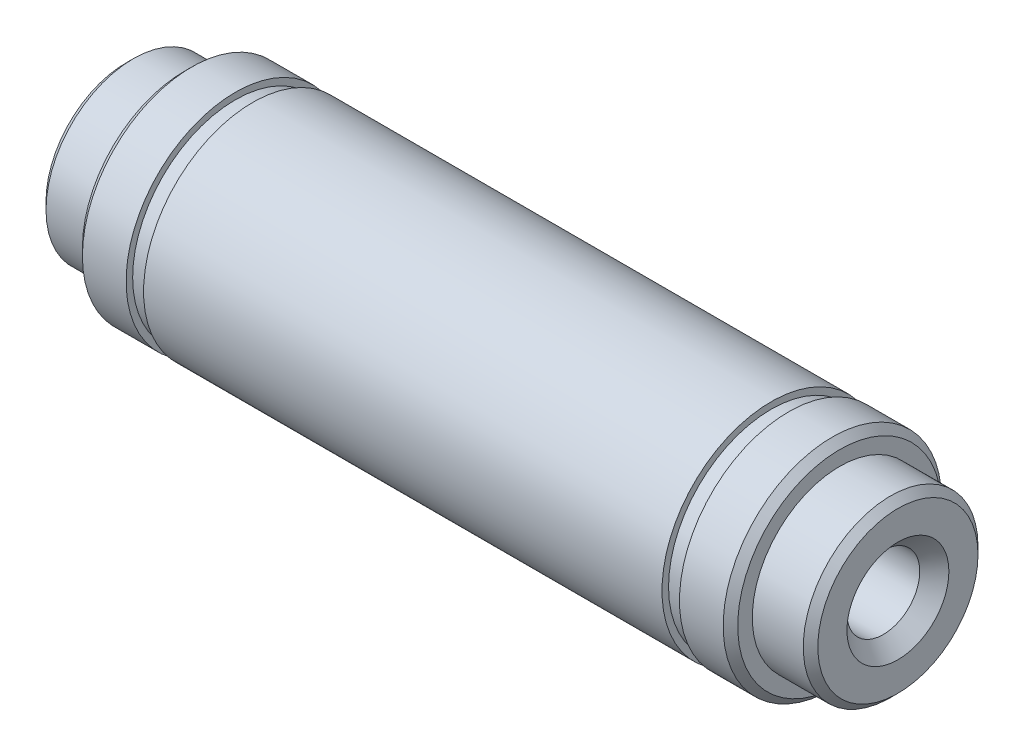
ISO-10303-21;
HEADER;
FILE_DESCRIPTION(('STEP AP214'),'2;1');
FILE_NAME('part.step','',(''),(''),'','','');
FILE_SCHEMA(('AUTOMOTIVE_DESIGN { 1 0 10303 214 1 1 1 1 }'));
ENDSEC;
DATA;
#1=APPLICATION_CONTEXT('core data for automotive mechanical design processes');
#2=APPLICATION_PROTOCOL_DEFINITION('international standard','automotive_design',2000,#1);
#3=PRODUCT_CONTEXT('',#1,'mechanical');
#4=PRODUCT('Part','Part','',(#3));
#5=PRODUCT_RELATED_PRODUCT_CATEGORY('part','',(#4));
#6=PRODUCT_DEFINITION_FORMATION('','',#4);
#7=PRODUCT_DEFINITION_CONTEXT('part definition',#1,'design');
#8=PRODUCT_DEFINITION('design','',#6,#7);
#9=PRODUCT_DEFINITION_SHAPE('','',#8);
#10=(LENGTH_UNIT() NAMED_UNIT(*) SI_UNIT(.MILLI.,.METRE.));
#11=(NAMED_UNIT(*) PLANE_ANGLE_UNIT() SI_UNIT($,.RADIAN.));
#12=(NAMED_UNIT(*) SI_UNIT($,.STERADIAN.) SOLID_ANGLE_UNIT());
#13=UNCERTAINTY_MEASURE_WITH_UNIT(LENGTH_MEASURE(1.E-05),#10,'distance_accuracy_value','');
#14=(GEOMETRIC_REPRESENTATION_CONTEXT(3) GLOBAL_UNCERTAINTY_ASSIGNED_CONTEXT((#13)) GLOBAL_UNIT_ASSIGNED_CONTEXT((#10,
#11,#12)) REPRESENTATION_CONTEXT('',''));
#15=CARTESIAN_POINT('',(0.,0.,0.));
#16=DIRECTION('',(0.,0.,1.));
#17=DIRECTION('',(1.,0.,0.));
#18=AXIS2_PLACEMENT_3D('',#15,#16,#17);
#19=CARTESIAN_POINT('',(0.,0.,0.));
#20=DIRECTION('',(1.,0.,0.));
#21=DIRECTION('',(0.,0.,-1.));
#22=AXIS2_PLACEMENT_3D('',#19,#20,#21);
#23=CYLINDRICAL_SURFACE('',#22,7.5);
#24=CARTESIAN_POINT('',(-22.,0.,0.));
#25=DIRECTION('',(-1.,0.,0.));
#26=DIRECTION('',(0.,0.,1.));
#27=AXIS2_PLACEMENT_3D('',#24,#25,#26);
#28=CIRCLE('',#27,7.5);
#29=CARTESIAN_POINT('',(-22.,0.,7.5));
#30=VERTEX_POINT('',#29);
#31=EDGE_CURVE('E104',#30,#30,#28,.F.);
#32=ORIENTED_EDGE('',*,*,#31,.T.);
#33=EDGE_LOOP('',(#32));
#34=FACE_BOUND('',#33,.T.);
#35=CARTESIAN_POINT('',(-19.,0.,0.));
#36=DIRECTION('',(1.,0.,0.));
#37=DIRECTION('',(0.,0.,-1.));
#38=AXIS2_PLACEMENT_3D('',#35,#36,#37);
#39=CIRCLE('',#38,7.5);
#40=CARTESIAN_POINT('',(-19.,0.,-7.5));
#41=VERTEX_POINT('',#40);
#42=EDGE_CURVE('E178',#41,#41,#39,.T.);
#43=ORIENTED_EDGE('',*,*,#42,.F.);
#44=EDGE_LOOP('',(#43));
#45=FACE_BOUND('',#44,.T.);
#46=ADVANCED_FACE('F51',(#34,#45),#23,.T.);
#47=CARTESIAN_POINT('',(-26.5,0.,0.));
#48=DIRECTION('',(-1.,0.,0.));
#49=DIRECTION('',(0.,0.,1.));
#50=AXIS2_PLACEMENT_3D('',#47,#48,#49);
#51=PLANE('',#50);
#52=CARTESIAN_POINT('',(-26.5,0.,0.));
#53=DIRECTION('',(-1.,0.,0.));
#54=DIRECTION('',(0.,0.,1.));
#55=AXIS2_PLACEMENT_3D('',#52,#53,#54);
#56=CIRCLE('',#55,5.49999999999999);
#57=CARTESIAN_POINT('',(-26.5,0.,5.49999999999999));
#58=VERTEX_POINT('',#57);
#59=EDGE_CURVE('E11',#58,#58,#56,.T.);
#60=ORIENTED_EDGE('',*,*,#59,.T.);
#61=EDGE_LOOP('',(#60));
#62=FACE_BOUND('',#61,.T.);
#63=CARTESIAN_POINT('',(-26.5,0.,0.));
#64=DIRECTION('',(-1.,0.,0.));
#65=DIRECTION('',(0.,0.,1.));
#66=AXIS2_PLACEMENT_3D('',#63,#64,#65);
#67=CIRCLE('',#66,3.5);
#68=CARTESIAN_POINT('',(-26.5,0.,3.5));
#69=VERTEX_POINT('',#68);
#70=EDGE_CURVE('E76',#69,#69,#67,.T.);
#71=ORIENTED_EDGE('',*,*,#70,.F.);
#72=EDGE_LOOP('',(#71));
#73=FACE_BOUND('',#72,.T.);
#74=ADVANCED_FACE('F131',(#62,#73),#51,.T.);
#75=CARTESIAN_POINT('',(0.,0.,0.));
#76=DIRECTION('',(1.,0.,0.));
#77=DIRECTION('',(0.,0.,-1.));
#78=AXIS2_PLACEMENT_3D('',#75,#76,#77);
#79=CYLINDRICAL_SURFACE('',#78,6.);
#80=CARTESIAN_POINT('',(-26.,0.,0.));
#81=DIRECTION('',(-1.,0.,0.));
#82=DIRECTION('',(0.,0.,1.));
#83=AXIS2_PLACEMENT_3D('',#80,#81,#82);
#84=CIRCLE('',#83,6.);
#85=CARTESIAN_POINT('',(-26.,0.,6.));
#86=VERTEX_POINT('',#85);
#87=EDGE_CURVE('E60',#86,#86,#84,.F.);
#88=ORIENTED_EDGE('',*,*,#87,.T.);
#89=EDGE_LOOP('',(#88));
#90=FACE_BOUND('',#89,.T.);
#91=CARTESIAN_POINT('',(-22.5,0.,0.));
#92=DIRECTION('',(1.,0.,0.));
#93=DIRECTION('',(0.,0.,-1.));
#94=AXIS2_PLACEMENT_3D('',#91,#92,#93);
#95=CIRCLE('',#94,6.);
#96=CARTESIAN_POINT('',(-22.5,0.,-6.));
#97=VERTEX_POINT('',#96);
#98=EDGE_CURVE('E95',#97,#97,#95,.T.);
#99=ORIENTED_EDGE('',*,*,#98,.F.);
#100=EDGE_LOOP('',(#99));
#101=FACE_BOUND('',#100,.T.);
#102=ADVANCED_FACE('F118',(#90,#101),#79,.T.);
#103=CARTESIAN_POINT('',(-22.5,6.,0.));
#104=DIRECTION('',(-1.,0.,0.));
#105=DIRECTION('',(0.,0.,1.));
#106=AXIS2_PLACEMENT_3D('',#103,#104,#105);
#107=PLANE('',#106);
#108=CARTESIAN_POINT('',(-22.5,0.,0.));
#109=DIRECTION('',(-1.,0.,0.));
#110=DIRECTION('',(0.,0.,1.));
#111=AXIS2_PLACEMENT_3D('',#108,#109,#110);
#112=CIRCLE('',#111,6.99999999999999);
#113=CARTESIAN_POINT('',(-22.5,0.,6.99999999999999));
#114=VERTEX_POINT('',#113);
#115=EDGE_CURVE('E107',#114,#114,#112,.T.);
#116=ORIENTED_EDGE('',*,*,#115,.T.);
#117=EDGE_LOOP('',(#116));
#118=FACE_BOUND('',#117,.T.);
#119=ORIENTED_EDGE('',*,*,#98,.T.);
#120=EDGE_LOOP('',(#119));
#121=FACE_BOUND('',#120,.T.);
#122=ADVANCED_FACE('F225',(#118,#121),#107,.T.);
#123=CARTESIAN_POINT('',(-9.5,0.,0.));
#124=DIRECTION('',(-1.,0.,0.));
#125=DIRECTION('',(0.,0.,1.));
#126=AXIS2_PLACEMENT_3D('',#123,#124,#125);
#127=CONICAL_SURFACE('',#126,2.49999999999999,1.02974425867665);
#128=CARTESIAN_POINT('',(-7.99784845243109,0.,0.));
#129=VERTEX_POINT('',#128);
#130=VERTEX_LOOP('',#129);
#131=FACE_BOUND('',#130,.T.);
#132=CARTESIAN_POINT('',(-9.5,0.,0.));
#133=DIRECTION('',(-1.,0.,0.));
#134=DIRECTION('',(0.,0.,1.));
#135=AXIS2_PLACEMENT_3D('',#132,#133,#134);
#136=CIRCLE('',#135,2.49999999999999);
#137=CARTESIAN_POINT('',(-9.5,0.,2.49999999999999));
#138=VERTEX_POINT('',#137);
#139=EDGE_CURVE('E89',#138,#138,#136,.T.);
#140=ORIENTED_EDGE('',*,*,#139,.T.);
#141=EDGE_LOOP('',(#140));
#142=FACE_BOUND('',#141,.T.);
#143=ADVANCED_FACE('F221',(#131,#142),#127,.F.);
#144=CARTESIAN_POINT('',(-26.5,0.,0.));
#145=DIRECTION('',(-1.,0.,0.));
#146=DIRECTION('',(0.,0.,1.));
#147=AXIS2_PLACEMENT_3D('',#144,#145,#146);
#148=CYLINDRICAL_SURFACE('',#147,2.49999999999999);
#149=ORIENTED_EDGE('',*,*,#139,.F.);
#150=EDGE_LOOP('',(#149));
#151=FACE_BOUND('',#150,.T.);
#152=CARTESIAN_POINT('',(-25.5,0.,0.));
#153=DIRECTION('',(-1.,0.,0.));
#154=DIRECTION('',(0.,0.,1.));
#155=AXIS2_PLACEMENT_3D('',#152,#153,#154);
#156=CIRCLE('',#155,2.5);
#157=CARTESIAN_POINT('',(-25.5,0.,2.5));
#158=VERTEX_POINT('',#157);
#159=EDGE_CURVE('E80',#158,#158,#156,.T.);
#160=ORIENTED_EDGE('',*,*,#159,.T.);
#161=EDGE_LOOP('',(#160));
#162=FACE_BOUND('',#161,.T.);
#163=ADVANCED_FACE('F217',(#151,#162),#148,.F.);
#164=CARTESIAN_POINT('',(-26.5,0.,0.));
#165=DIRECTION('',(-1.,0.,0.));
#166=DIRECTION('',(0.,0.,1.));
#167=AXIS2_PLACEMENT_3D('',#164,#165,#166);
#168=CONICAL_SURFACE('',#167,3.5,0.785398163397449);
#169=ORIENTED_EDGE('',*,*,#159,.F.);
#170=EDGE_LOOP('',(#169));
#171=FACE_BOUND('',#170,.T.);
#172=ORIENTED_EDGE('',*,*,#70,.T.);
#173=EDGE_LOOP('',(#172));
#174=FACE_BOUND('',#173,.T.);
#175=ADVANCED_FACE('F213',(#171,#174),#168,.F.);
#176=CARTESIAN_POINT('',(-19.,7.5,0.));
#177=DIRECTION('',(-1.,0.,0.));
#178=DIRECTION('',(0.,0.,1.));
#179=AXIS2_PLACEMENT_3D('',#176,#177,#178);
#180=PLANE('',#179);
#181=CARTESIAN_POINT('',(-19.,0.,0.));
#182=DIRECTION('',(1.,0.,0.));
#183=DIRECTION('',(0.,0.,-1.));
#184=AXIS2_PLACEMENT_3D('',#181,#182,#183);
#185=CIRCLE('',#184,7.05);
#186=CARTESIAN_POINT('',(-19.,0.,-7.05));
#187=VERTEX_POINT('',#186);
#188=EDGE_CURVE('E182',#187,#187,#185,.T.);
#189=ORIENTED_EDGE('',*,*,#188,.F.);
#190=EDGE_LOOP('',(#189));
#191=FACE_BOUND('',#190,.T.);
#192=ORIENTED_EDGE('',*,*,#42,.T.);
#193=EDGE_LOOP('',(#192));
#194=FACE_BOUND('',#193,.T.);
#195=ADVANCED_FACE('F216',(#191,#194),#180,.F.);
#196=CARTESIAN_POINT('',(0.,0.,0.));
#197=DIRECTION('',(1.,0.,0.));
#198=DIRECTION('',(0.,0.,-1.));
#199=AXIS2_PLACEMENT_3D('',#196,#197,#198);
#200=CYLINDRICAL_SURFACE('',#199,7.05);
#201=CARTESIAN_POINT('',(-17.8,0.,0.));
#202=DIRECTION('',(1.,0.,0.));
#203=DIRECTION('',(0.,0.,-1.));
#204=AXIS2_PLACEMENT_3D('',#201,#202,#203);
#205=CIRCLE('',#204,7.05);
#206=CARTESIAN_POINT('',(-17.8,0.,-7.05));
#207=VERTEX_POINT('',#206);
#208=EDGE_CURVE('E187',#207,#207,#205,.T.);
#209=ORIENTED_EDGE('',*,*,#208,.F.);
#210=EDGE_LOOP('',(#209));
#211=FACE_BOUND('',#210,.T.);
#212=ORIENTED_EDGE('',*,*,#188,.T.);
#213=EDGE_LOOP('',(#212));
#214=FACE_BOUND('',#213,.T.);
#215=ADVANCED_FACE('F338',(#211,#214),#200,.T.);
#216=CARTESIAN_POINT('',(-17.8,7.05,0.));
#217=DIRECTION('',(1.,0.,0.));
#218=DIRECTION('',(0.,0.,-1.));
#219=AXIS2_PLACEMENT_3D('',#216,#217,#218);
#220=PLANE('',#219);
#221=CARTESIAN_POINT('',(-17.8,0.,0.));
#222=DIRECTION('',(1.,0.,0.));
#223=DIRECTION('',(0.,0.,-1.));
#224=AXIS2_PLACEMENT_3D('',#221,#222,#223);
#225=CIRCLE('',#224,7.5);
#226=CARTESIAN_POINT('',(-17.8,0.,-7.5));
#227=VERTEX_POINT('',#226);
#228=EDGE_CURVE('E171',#227,#227,#225,.T.);
#229=ORIENTED_EDGE('',*,*,#228,.F.);
#230=EDGE_LOOP('',(#229));
#231=FACE_BOUND('',#230,.T.);
#232=ORIENTED_EDGE('',*,*,#208,.T.);
#233=EDGE_LOOP('',(#232));
#234=FACE_BOUND('',#233,.T.);
#235=ADVANCED_FACE('F147',(#231,#234),#220,.F.);
#236=ORIENTED_EDGE('',*,*,#228,.T.);
#237=EDGE_LOOP('',(#236));
#238=FACE_BOUND('',#237,.T.);
#239=CARTESIAN_POINT('',(17.8,0.,0.));
#240=DIRECTION('',(1.,0.,0.));
#241=DIRECTION('',(0.,0.,-1.));
#242=AXIS2_PLACEMENT_3D('',#239,#240,#241);
#243=CIRCLE('',#242,7.5);
#244=CARTESIAN_POINT('',(17.8,0.,-7.5));
#245=VERTEX_POINT('',#244);
#246=EDGE_CURVE('E167',#245,#245,#243,.T.);
#247=ORIENTED_EDGE('',*,*,#246,.F.);
#248=EDGE_LOOP('',(#247));
#249=FACE_BOUND('',#248,.T.);
#250=ADVANCED_FACE('F134',(#238,#249),#23,.T.);
#251=CARTESIAN_POINT('',(17.8,7.05,0.));
#252=DIRECTION('',(-1.,0.,0.));
#253=DIRECTION('',(0.,0.,1.));
#254=AXIS2_PLACEMENT_3D('',#251,#252,#253);
#255=PLANE('',#254);
#256=CARTESIAN_POINT('',(17.8,0.,0.));
#257=DIRECTION('',(1.,0.,0.));
#258=DIRECTION('',(0.,0.,-1.));
#259=AXIS2_PLACEMENT_3D('',#256,#257,#258);
#260=CIRCLE('',#259,7.05);
#261=CARTESIAN_POINT('',(17.8,0.,-7.05));
#262=VERTEX_POINT('',#261);
#263=EDGE_CURVE('E174',#262,#262,#260,.T.);
#264=ORIENTED_EDGE('',*,*,#263,.F.);
#265=EDGE_LOOP('',(#264));
#266=FACE_BOUND('',#265,.T.);
#267=ORIENTED_EDGE('',*,*,#246,.T.);
#268=EDGE_LOOP('',(#267));
#269=FACE_BOUND('',#268,.T.);
#270=ADVANCED_FACE('F146',(#266,#269),#255,.F.);
#271=CARTESIAN_POINT('',(19.,7.5,0.));
#272=DIRECTION('',(1.,0.,0.));
#273=DIRECTION('',(0.,0.,-1.));
#274=AXIS2_PLACEMENT_3D('',#271,#272,#273);
#275=PLANE('',#274);
#276=CARTESIAN_POINT('',(19.,0.,0.));
#277=DIRECTION('',(1.,0.,0.));
#278=DIRECTION('',(0.,0.,-1.));
#279=AXIS2_PLACEMENT_3D('',#276,#277,#278);
#280=CIRCLE('',#279,7.5);
#281=CARTESIAN_POINT('',(19.,0.,-7.5));
#282=VERTEX_POINT('',#281);
#283=EDGE_CURVE('E165',#282,#282,#280,.T.);
#284=ORIENTED_EDGE('',*,*,#283,.F.);
#285=EDGE_LOOP('',(#284));
#286=FACE_BOUND('',#285,.T.);
#287=CARTESIAN_POINT('',(19.,0.,0.));
#288=DIRECTION('',(1.,0.,0.));
#289=DIRECTION('',(0.,0.,-1.));
#290=AXIS2_PLACEMENT_3D('',#287,#288,#289);
#291=CIRCLE('',#290,7.05);
#292=CARTESIAN_POINT('',(19.,0.,-7.05));
#293=VERTEX_POINT('',#292);
#294=EDGE_CURVE('E168',#293,#293,#291,.T.);
#295=ORIENTED_EDGE('',*,*,#294,.T.);
#296=EDGE_LOOP('',(#295));
#297=FACE_BOUND('',#296,.T.);
#298=ADVANCED_FACE('F196',(#286,#297),#275,.F.);
#299=CARTESIAN_POINT('',(0.,0.,0.));
#300=DIRECTION('',(1.,0.,0.));
#301=DIRECTION('',(0.,0.,-1.));
#302=AXIS2_PLACEMENT_3D('',#299,#300,#301);
#303=CYLINDRICAL_SURFACE('',#302,7.05);
#304=ORIENTED_EDGE('',*,*,#294,.F.);
#305=EDGE_LOOP('',(#304));
#306=FACE_BOUND('',#305,.T.);
#307=ORIENTED_EDGE('',*,*,#263,.T.);
#308=EDGE_LOOP('',(#307));
#309=FACE_BOUND('',#308,.T.);
#310=ADVANCED_FACE('F70',(#306,#309),#303,.T.);
#311=CARTESIAN_POINT('',(9.5,0.,0.));
#312=DIRECTION('',(1.,0.,0.));
#313=DIRECTION('',(0.,0.,-1.));
#314=AXIS2_PLACEMENT_3D('',#311,#312,#313);
#315=CONICAL_SURFACE('',#314,2.5,1.02974425867665);
#316=CARTESIAN_POINT('',(7.99784845243109,0.,0.));
#317=VERTEX_POINT('',#316);
#318=VERTEX_LOOP('',#317);
#319=FACE_BOUND('',#318,.T.);
#320=CARTESIAN_POINT('',(9.5,0.,0.));
#321=DIRECTION('',(1.,0.,0.));
#322=DIRECTION('',(0.,0.,-1.));
#323=AXIS2_PLACEMENT_3D('',#320,#321,#322);
#324=CIRCLE('',#323,2.5);
#325=CARTESIAN_POINT('',(9.5,0.,-2.5));
#326=VERTEX_POINT('',#325);
#327=EDGE_CURVE('E74',#326,#326,#324,.T.);
#328=ORIENTED_EDGE('',*,*,#327,.T.);
#329=EDGE_LOOP('',(#328));
#330=FACE_BOUND('',#329,.T.);
#331=ADVANCED_FACE('F66',(#319,#330),#315,.F.);
#332=CARTESIAN_POINT('',(26.5,0.,0.));
#333=DIRECTION('',(1.,0.,0.));
#334=DIRECTION('',(0.,0.,-1.));
#335=AXIS2_PLACEMENT_3D('',#332,#333,#334);
#336=CYLINDRICAL_SURFACE('',#335,2.5);
#337=ORIENTED_EDGE('',*,*,#327,.F.);
#338=EDGE_LOOP('',(#337));
#339=FACE_BOUND('',#338,.T.);
#340=CARTESIAN_POINT('',(25.5,0.,0.));
#341=DIRECTION('',(1.,0.,0.));
#342=DIRECTION('',(0.,0.,-1.));
#343=AXIS2_PLACEMENT_3D('',#340,#341,#342);
#344=CIRCLE('',#343,2.5);
#345=CARTESIAN_POINT('',(25.5,0.,-2.5));
#346=VERTEX_POINT('',#345);
#347=EDGE_CURVE('E77',#346,#346,#344,.T.);
#348=ORIENTED_EDGE('',*,*,#347,.T.);
#349=EDGE_LOOP('',(#348));
#350=FACE_BOUND('',#349,.T.);
#351=ADVANCED_FACE('F69',(#339,#350),#336,.F.);
#352=CARTESIAN_POINT('',(26.5,0.,0.));
#353=DIRECTION('',(1.,0.,0.));
#354=DIRECTION('',(0.,0.,-1.));
#355=AXIS2_PLACEMENT_3D('',#352,#353,#354);
#356=CONICAL_SURFACE('',#355,3.5,0.785398163397449);
#357=ORIENTED_EDGE('',*,*,#347,.F.);
#358=EDGE_LOOP('',(#357));
#359=FACE_BOUND('',#358,.T.);
#360=CARTESIAN_POINT('',(26.5,0.,0.));
#361=DIRECTION('',(1.,0.,0.));
#362=DIRECTION('',(0.,0.,-1.));
#363=AXIS2_PLACEMENT_3D('',#360,#361,#362);
#364=CIRCLE('',#363,3.5);
#365=CARTESIAN_POINT('',(26.5,0.,-3.5));
#366=VERTEX_POINT('',#365);
#367=EDGE_CURVE('E83',#366,#366,#364,.T.);
#368=ORIENTED_EDGE('',*,*,#367,.T.);
#369=EDGE_LOOP('',(#368));
#370=FACE_BOUND('',#369,.T.);
#371=ADVANCED_FACE('F206',(#359,#370),#356,.F.);
#372=CARTESIAN_POINT('',(26.5,6.,0.));
#373=DIRECTION('',(1.,0.,0.));
#374=DIRECTION('',(0.,0.,-1.));
#375=AXIS2_PLACEMENT_3D('',#372,#373,#374);
#376=PLANE('',#375);
#377=CARTESIAN_POINT('',(26.5,0.,0.));
#378=DIRECTION('',(1.,0.,0.));
#379=DIRECTION('',(0.,0.,-1.));
#380=AXIS2_PLACEMENT_3D('',#377,#378,#379);
#381=CIRCLE('',#380,5.5);
#382=CARTESIAN_POINT('',(26.5,0.,-5.5));
#383=VERTEX_POINT('',#382);
#384=EDGE_CURVE('E110',#383,#383,#381,.T.);
#385=ORIENTED_EDGE('',*,*,#384,.T.);
#386=EDGE_LOOP('',(#385));
#387=FACE_BOUND('',#386,.T.);
#388=ORIENTED_EDGE('',*,*,#367,.F.);
#389=EDGE_LOOP('',(#388));
#390=FACE_BOUND('',#389,.T.);
#391=ADVANCED_FACE('F209',(#387,#390),#376,.T.);
#392=CARTESIAN_POINT('',(0.,0.,0.));
#393=DIRECTION('',(1.,0.,0.));
#394=DIRECTION('',(0.,0.,-1.));
#395=AXIS2_PLACEMENT_3D('',#392,#393,#394);
#396=CYLINDRICAL_SURFACE('',#395,6.);
#397=CARTESIAN_POINT('',(26.,0.,0.));
#398=DIRECTION('',(1.,0.,0.));
#399=DIRECTION('',(0.,0.,-1.));
#400=AXIS2_PLACEMENT_3D('',#397,#398,#399);
#401=CIRCLE('',#400,6.);
#402=CARTESIAN_POINT('',(26.,0.,-6.));
#403=VERTEX_POINT('',#402);
#404=EDGE_CURVE('E113',#403,#403,#401,.F.);
#405=ORIENTED_EDGE('',*,*,#404,.T.);
#406=EDGE_LOOP('',(#405));
#407=FACE_BOUND('',#406,.T.);
#408=CARTESIAN_POINT('',(22.5,0.,0.));
#409=DIRECTION('',(1.,0.,0.));
#410=DIRECTION('',(0.,0.,-1.));
#411=AXIS2_PLACEMENT_3D('',#408,#409,#410);
#412=CIRCLE('',#411,6.);
#413=CARTESIAN_POINT('',(22.5,0.,-6.));
#414=VERTEX_POINT('',#413);
#415=EDGE_CURVE('E92',#414,#414,#412,.T.);
#416=ORIENTED_EDGE('',*,*,#415,.T.);
#417=EDGE_LOOP('',(#416));
#418=FACE_BOUND('',#417,.T.);
#419=ADVANCED_FACE('F159',(#407,#418),#396,.T.);
#420=CARTESIAN_POINT('',(22.5,7.5,0.));
#421=DIRECTION('',(1.,0.,0.));
#422=DIRECTION('',(0.,0.,-1.));
#423=AXIS2_PLACEMENT_3D('',#420,#421,#422);
#424=PLANE('',#423);
#425=CARTESIAN_POINT('',(22.5,0.,0.));
#426=DIRECTION('',(1.,0.,0.));
#427=DIRECTION('',(0.,0.,-1.));
#428=AXIS2_PLACEMENT_3D('',#425,#426,#427);
#429=CIRCLE('',#428,7.);
#430=CARTESIAN_POINT('',(22.5,0.,-7.));
#431=VERTEX_POINT('',#430);
#432=EDGE_CURVE('E98',#431,#431,#429,.T.);
#433=ORIENTED_EDGE('',*,*,#432,.T.);
#434=EDGE_LOOP('',(#433));
#435=FACE_BOUND('',#434,.T.);
#436=ORIENTED_EDGE('',*,*,#415,.F.);
#437=EDGE_LOOP('',(#436));
#438=FACE_BOUND('',#437,.T.);
#439=ADVANCED_FACE('F151',(#435,#438),#424,.T.);
#440=CARTESIAN_POINT('',(22.,0.,0.));
#441=DIRECTION('',(1.,0.,0.));
#442=DIRECTION('',(0.,0.,-1.));
#443=AXIS2_PLACEMENT_3D('',#440,#441,#442);
#444=CIRCLE('',#443,7.5);
#445=CARTESIAN_POINT('',(22.,0.,-7.5));
#446=VERTEX_POINT('',#445);
#447=EDGE_CURVE('E101',#446,#446,#444,.F.);
#448=ORIENTED_EDGE('',*,*,#447,.T.);
#449=EDGE_LOOP('',(#448));
#450=FACE_BOUND('',#449,.T.);
#451=ORIENTED_EDGE('',*,*,#283,.T.);
#452=EDGE_LOOP('',(#451));
#453=FACE_BOUND('',#452,.T.);
#454=ADVANCED_FACE('F135',(#450,#453),#23,.T.);
#455=CARTESIAN_POINT('',(22.5,0.,0.));
#456=DIRECTION('',(-1.,0.,0.));
#457=DIRECTION('',(0.,0.,1.));
#458=AXIS2_PLACEMENT_3D('',#455,#456,#457);
#459=CONICAL_SURFACE('',#458,7.,0.785398163397448);
#460=ORIENTED_EDGE('',*,*,#447,.F.);
#461=EDGE_LOOP('',(#460));
#462=FACE_BOUND('',#461,.T.);
#463=ORIENTED_EDGE('',*,*,#432,.F.);
#464=EDGE_LOOP('',(#463));
#465=FACE_BOUND('',#464,.T.);
#466=ADVANCED_FACE('F150',(#462,#465),#459,.T.);
#467=CARTESIAN_POINT('',(-22.,0.,0.));
#468=DIRECTION('',(1.,0.,0.));
#469=DIRECTION('',(0.,0.,-1.));
#470=AXIS2_PLACEMENT_3D('',#467,#468,#469);
#471=CONICAL_SURFACE('',#470,7.5,0.785398163397459);
#472=ORIENTED_EDGE('',*,*,#115,.F.);
#473=EDGE_LOOP('',(#472));
#474=FACE_BOUND('',#473,.T.);
#475=ORIENTED_EDGE('',*,*,#31,.F.);
#476=EDGE_LOOP('',(#475));
#477=FACE_BOUND('',#476,.T.);
#478=ADVANCED_FACE('F127',(#474,#477),#471,.T.);
#479=CARTESIAN_POINT('',(26.5,0.,0.));
#480=DIRECTION('',(-1.,0.,0.));
#481=DIRECTION('',(0.,0.,1.));
#482=AXIS2_PLACEMENT_3D('',#479,#480,#481);
#483=CONICAL_SURFACE('',#482,5.5,0.785398163397443);
#484=ORIENTED_EDGE('',*,*,#404,.F.);
#485=EDGE_LOOP('',(#484));
#486=FACE_BOUND('',#485,.T.);
#487=ORIENTED_EDGE('',*,*,#384,.F.);
#488=EDGE_LOOP('',(#487));
#489=FACE_BOUND('',#488,.T.);
#490=ADVANCED_FACE('F122',(#486,#489),#483,.T.);
#491=CARTESIAN_POINT('',(-26.,0.,0.));
#492=DIRECTION('',(1.,0.,0.));
#493=DIRECTION('',(0.,0.,-1.));
#494=AXIS2_PLACEMENT_3D('',#491,#492,#493);
#495=CONICAL_SURFACE('',#494,6.,0.785398163397454);
#496=ORIENTED_EDGE('',*,*,#59,.F.);
#497=EDGE_LOOP('',(#496));
#498=FACE_BOUND('',#497,.T.);
#499=ORIENTED_EDGE('',*,*,#87,.F.);
#500=EDGE_LOOP('',(#499));
#501=FACE_BOUND('',#500,.T.);
#502=ADVANCED_FACE('F54',(#498,#501),#495,.T.);
#503=CLOSED_SHELL('',(#46,#74,#102,#122,#143,#163,#175,#195,#215,#235,#250,#270,#298,#310,#331,
#351,#371,#391,#419,#439,#454,#466,#478,#490,#502));
#504=MANIFOLD_SOLID_BREP('B2',#503);
#505=ADVANCED_BREP_SHAPE_REPRESENTATION('',(#18,#504),#14);
#506=SHAPE_DEFINITION_REPRESENTATION(#9,#505);
ENDSEC;
END-ISO-10303-21;
